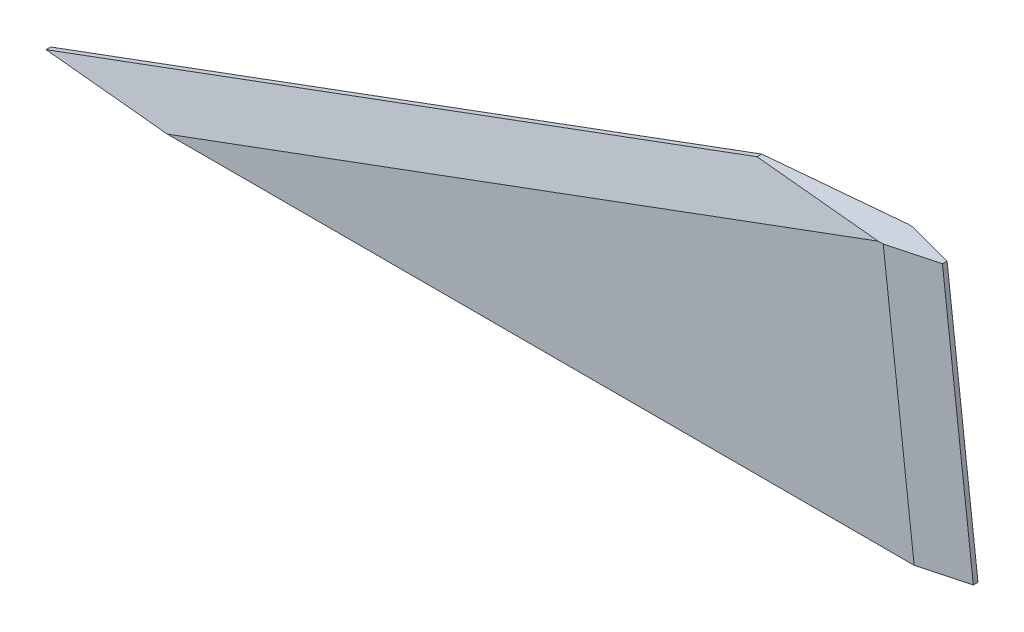
ISO-10303-21;
HEADER;
FILE_DESCRIPTION(('STEP AP214'),'2;1');
FILE_NAME('part.step','',(''),(''),'','','');
FILE_SCHEMA(('AUTOMOTIVE_DESIGN { 1 0 10303 214 1 1 1 1 }'));
ENDSEC;
DATA;
#1=APPLICATION_CONTEXT('core data for automotive mechanical design processes');
#2=APPLICATION_PROTOCOL_DEFINITION('international standard','automotive_design',2000,#1);
#3=PRODUCT_CONTEXT('',#1,'mechanical');
#4=PRODUCT('Part','Part','',(#3));
#5=PRODUCT_RELATED_PRODUCT_CATEGORY('part','',(#4));
#6=PRODUCT_DEFINITION_FORMATION('','',#4);
#7=PRODUCT_DEFINITION_CONTEXT('part definition',#1,'design');
#8=PRODUCT_DEFINITION('design','',#6,#7);
#9=PRODUCT_DEFINITION_SHAPE('','',#8);
#10=(LENGTH_UNIT() NAMED_UNIT(*) SI_UNIT(.MILLI.,.METRE.));
#11=(NAMED_UNIT(*) PLANE_ANGLE_UNIT() SI_UNIT($,.RADIAN.));
#12=(NAMED_UNIT(*) SI_UNIT($,.STERADIAN.) SOLID_ANGLE_UNIT());
#13=UNCERTAINTY_MEASURE_WITH_UNIT(LENGTH_MEASURE(1.E-05),#10,'distance_accuracy_value','');
#14=(GEOMETRIC_REPRESENTATION_CONTEXT(3) GLOBAL_UNCERTAINTY_ASSIGNED_CONTEXT((#13)) GLOBAL_UNIT_ASSIGNED_CONTEXT((#10,
#11,#12)) REPRESENTATION_CONTEXT('',''));
#15=CARTESIAN_POINT('',(0.,0.,0.));
#16=DIRECTION('',(0.,0.,1.));
#17=DIRECTION('',(1.,0.,0.));
#18=AXIS2_PLACEMENT_3D('',#15,#16,#17);
#19=CARTESIAN_POINT('',(76.2,0.,1.2192));
#20=DIRECTION('',(0.,1.,0.));
#21=DIRECTION('',(0.,0.,1.));
#22=AXIS2_PLACEMENT_3D('',#19,#20,#21);
#23=PLANE('',#22);
#24=DIRECTION('',(0.,0.,-1.));
#25=VECTOR('',#24,1.);
#26=CARTESIAN_POINT('',(76.2,0.,1.2192));
#27=LINE('',#26,#25);
#28=CARTESIAN_POINT('',(76.2,0.,0.190499999999973));
#29=VERTEX_POINT('',#28);
#30=CARTESIAN_POINT('',(76.2,0.,-0.190499999999999));
#31=VERTEX_POINT('',#30);
#32=EDGE_CURVE('E136',#29,#31,#27,.T.);
#33=ORIENTED_EDGE('',*,*,#32,.F.);
#34=DIRECTION('',(-0.965877160229926,0.,0.259000601053691));
#35=VECTOR('',#34,1.);
#36=CARTESIAN_POINT('',(71.4420928321807,0.,1.46633596233861));
#37=LINE('',#36,#35);
#38=CARTESIAN_POINT('',(72.3637238265614,0.,1.2192));
#39=VERTEX_POINT('',#38);
#40=EDGE_CURVE('E55',#29,#39,#37,.T.);
#41=ORIENTED_EDGE('',*,*,#40,.T.);
#42=DIRECTION('',(1.,0.,0.));
#43=VECTOR('',#42,1.);
#44=CARTESIAN_POINT('',(76.2,0.,1.2192));
#45=LINE('',#44,#43);
#46=CARTESIAN_POINT('',(10.9909085581792,0.,1.2192));
#47=VERTEX_POINT('',#46);
#48=EDGE_CURVE('E130',#47,#39,#45,.T.);
#49=ORIENTED_EDGE('',*,*,#48,.F.);
#50=DIRECTION('',(-0.995648506569009,0.,-0.0931882576664113));
#51=VECTOR('',#50,1.);
#52=CARTESIAN_POINT('',(1.40471330294,0.,0.321974897374045));
#53=LINE('',#52,#51);
#54=CARTESIAN_POINT('',(0.,0.,0.190499999999974));
#55=VERTEX_POINT('',#54);
#56=EDGE_CURVE('E113',#47,#55,#53,.T.);
#57=ORIENTED_EDGE('',*,*,#56,.T.);
#58=DIRECTION('',(0.,0.,-1.));
#59=VECTOR('',#58,1.);
#60=CARTESIAN_POINT('',(0.,0.,1.2192));
#61=LINE('',#60,#59);
#62=CARTESIAN_POINT('',(0.,0.,-0.190499999999999));
#63=VERTEX_POINT('',#62);
#64=EDGE_CURVE('E144',#55,#63,#61,.T.);
#65=ORIENTED_EDGE('',*,*,#64,.T.);
#66=DIRECTION('',(-0.99564850656901,0.,0.0931882576664078));
#67=VECTOR('',#66,1.);
#68=CARTESIAN_POINT('',(0.,0.,-0.190499999999999));
#69=LINE('',#68,#67);
#70=CARTESIAN_POINT('',(10.9909085581793,0.,-1.2192));
#71=VERTEX_POINT('',#70);
#72=EDGE_CURVE('E124',#63,#71,#69,.F.);
#73=ORIENTED_EDGE('',*,*,#72,.T.);
#74=DIRECTION('',(1.,0.,0.));
#75=VECTOR('',#74,1.);
#76=CARTESIAN_POINT('',(76.2,0.,-1.2192));
#77=LINE('',#76,#75);
#78=CARTESIAN_POINT('',(72.3637238265614,0.,-1.2192));
#79=VERTEX_POINT('',#78);
#80=EDGE_CURVE('E146',#71,#79,#77,.T.);
#81=ORIENTED_EDGE('',*,*,#80,.T.);
#82=DIRECTION('',(-0.965877160229929,0.,-0.259000601053682));
#83=VECTOR('',#82,1.);
#84=CARTESIAN_POINT('',(73.8303865308193,0.,-0.825913423210683));
#85=LINE('',#84,#83);
#86=EDGE_CURVE('E67',#79,#31,#85,.F.);
#87=ORIENTED_EDGE('',*,*,#86,.T.);
#88=EDGE_LOOP('',(#33,#41,#49,#57,#65,#73,#81,#87));
#89=FACE_BOUND('',#88,.T.);
#90=ADVANCED_FACE('F45',(#89),#23,.F.);
#91=CARTESIAN_POINT('',(73.66,21.59,1.2192));
#92=DIRECTION('',(-0.993150604322876,-0.116841247567398,0.));
#93=DIRECTION('',(0.116841247567398,-0.993150604322876,0.));
#94=AXIS2_PLACEMENT_3D('',#91,#92,#93);
#95=PLANE('',#94);
#96=DIRECTION('',(0.,0.,-1.));
#97=VECTOR('',#96,1.);
#98=CARTESIAN_POINT('',(73.66,21.59,1.2192));
#99=LINE('',#98,#97);
#100=CARTESIAN_POINT('',(73.66,21.59,0.190499999999973));
#101=VERTEX_POINT('',#100);
#102=CARTESIAN_POINT('',(73.66,21.59,-0.190499999999999));
#103=VERTEX_POINT('',#102);
#104=EDGE_CURVE('E157',#101,#103,#99,.T.);
#105=ORIENTED_EDGE('',*,*,#104,.F.);
#106=DIRECTION('',(0.116841247567398,-0.993150604322876,0.));
#107=VECTOR('',#106,1.);
#108=CARTESIAN_POINT('',(76.2,0.,0.190499999999973));
#109=LINE('',#108,#107);
#110=EDGE_CURVE('E193',#101,#29,#109,.T.);
#111=ORIENTED_EDGE('',*,*,#110,.T.);
#112=ORIENTED_EDGE('',*,*,#32,.T.);
#113=DIRECTION('',(-0.116841247567398,0.993150604322876,0.));
#114=VECTOR('',#113,1.);
#115=CARTESIAN_POINT('',(73.66,21.59,-0.190499999999999));
#116=LINE('',#115,#114);
#117=EDGE_CURVE('E189',#31,#103,#116,.T.);
#118=ORIENTED_EDGE('',*,*,#117,.T.);
#119=EDGE_LOOP('',(#105,#111,#112,#118));
#120=FACE_BOUND('',#119,.T.);
#121=ADVANCED_FACE('F201',(#120),#95,.F.);
#122=CARTESIAN_POINT('',(58.42,21.59,1.2192));
#123=DIRECTION('',(0.,-1.,0.));
#124=DIRECTION('',(1.,0.,0.));
#125=AXIS2_PLACEMENT_3D('',#122,#123,#124);
#126=PLANE('',#125);
#127=DIRECTION('',(-1.,0.,0.));
#128=VECTOR('',#127,1.);
#129=CARTESIAN_POINT('',(58.42,21.59,1.2192));
#130=LINE('',#129,#128);
#131=CARTESIAN_POINT('',(69.8237238265614,21.59,1.2192));
#132=VERTEX_POINT('',#131);
#133=CARTESIAN_POINT('',(69.4109085581792,21.59,1.2192));
#134=VERTEX_POINT('',#133);
#135=EDGE_CURVE('E133',#132,#134,#130,.T.);
#136=ORIENTED_EDGE('',*,*,#135,.F.);
#137=DIRECTION('',(0.965877160229926,0.,-0.259000601053691));
#138=VECTOR('',#137,1.);
#139=CARTESIAN_POINT('',(71.2717063013614,21.59,0.830922539127903));
#140=LINE('',#139,#138);
#141=EDGE_CURVE('E186',#132,#101,#140,.T.);
#142=ORIENTED_EDGE('',*,*,#141,.T.);
#143=ORIENTED_EDGE('',*,*,#104,.T.);
#144=DIRECTION('',(0.965877160229929,0.,0.259000601053682));
#145=VECTOR('',#144,1.);
#146=CARTESIAN_POINT('',(73.66,21.59,-0.190499999999999));
#147=LINE('',#146,#145);
#148=CARTESIAN_POINT('',(69.8237238265613,21.59,-1.2192));
#149=VERTEX_POINT('',#148);
#150=EDGE_CURVE('E183',#103,#149,#147,.F.);
#151=ORIENTED_EDGE('',*,*,#150,.T.);
#152=DIRECTION('',(-1.,0.,0.));
#153=VECTOR('',#152,1.);
#154=CARTESIAN_POINT('',(58.42,21.59,-1.2192));
#155=LINE('',#154,#153);
#156=CARTESIAN_POINT('',(69.4109085581793,21.59,-1.2192));
#157=VERTEX_POINT('',#156);
#158=EDGE_CURVE('E140',#149,#157,#155,.T.);
#159=ORIENTED_EDGE('',*,*,#158,.T.);
#160=DIRECTION('',(0.99564850656901,0.,-0.0931882576664077));
#161=VECTOR('',#160,1.);
#162=CARTESIAN_POINT('',(0.50732228085434,21.59,5.2298682301906));
#163=LINE('',#162,#161);
#164=CARTESIAN_POINT('',(58.42,21.59,-0.190499999999999));
#165=VERTEX_POINT('',#164);
#166=EDGE_CURVE('E170',#157,#165,#163,.F.);
#167=ORIENTED_EDGE('',*,*,#166,.T.);
#168=DIRECTION('',(0.,0.,-1.));
#169=VECTOR('',#168,1.);
#170=CARTESIAN_POINT('',(58.42,21.59,1.2192));
#171=LINE('',#170,#169);
#172=CARTESIAN_POINT('',(58.42,21.59,0.190499999999974));
#173=VERTEX_POINT('',#172);
#174=EDGE_CURVE('E153',#173,#165,#171,.T.);
#175=ORIENTED_EDGE('',*,*,#174,.F.);
#176=DIRECTION('',(0.995648506569009,0.,0.0931882576664112));
#177=VECTOR('',#176,1.);
#178=CARTESIAN_POINT('',(1.91203558379438,21.59,-5.09839333281675));
#179=LINE('',#178,#177);
#180=EDGE_CURVE('E173',#173,#134,#179,.T.);
#181=ORIENTED_EDGE('',*,*,#180,.T.);
#182=EDGE_LOOP('',(#136,#142,#143,#151,#159,#167,#175,#181));
#183=FACE_BOUND('',#182,.T.);
#184=ADVANCED_FACE('F206',(#183),#126,.F.);
#185=CARTESIAN_POINT('',(0.,0.,1.2192));
#186=DIRECTION('',(0.346650140871629,-0.937994498829114,0.));
#187=DIRECTION('',(0.937994498829114,0.346650140871629,0.));
#188=AXIS2_PLACEMENT_3D('',#185,#186,#187);
#189=PLANE('',#188);
#190=ORIENTED_EDGE('',*,*,#64,.F.);
#191=DIRECTION('',(0.937994498829114,0.346650140871629,0.));
#192=VECTOR('',#191,1.);
#193=CARTESIAN_POINT('',(58.42,21.59,0.190499999999974));
#194=LINE('',#193,#192);
#195=EDGE_CURVE('E118',#55,#173,#194,.T.);
#196=ORIENTED_EDGE('',*,*,#195,.T.);
#197=ORIENTED_EDGE('',*,*,#174,.T.);
#198=DIRECTION('',(-0.937994498829114,-0.346650140871629,0.));
#199=VECTOR('',#198,1.);
#200=CARTESIAN_POINT('',(0.,0.,-0.190499999999999));
#201=LINE('',#200,#199);
#202=EDGE_CURVE('E123',#165,#63,#201,.T.);
#203=ORIENTED_EDGE('',*,*,#202,.T.);
#204=EDGE_LOOP('',(#190,#196,#197,#203));
#205=FACE_BOUND('',#204,.T.);
#206=ADVANCED_FACE('F211',(#205),#189,.F.);
#207=CARTESIAN_POINT('',(0.,0.,1.2192));
#208=DIRECTION('',(0.,0.,1.));
#209=DIRECTION('',(1.,0.,0.));
#210=AXIS2_PLACEMENT_3D('',#207,#208,#209);
#211=PLANE('',#210);
#212=ORIENTED_EDGE('',*,*,#48,.T.);
#213=DIRECTION('',(-0.116841247567398,0.993150604322876,0.));
#214=VECTOR('',#213,1.);
#215=CARTESIAN_POINT('',(69.8760961975298,21.1448348467682,1.2192));
#216=LINE('',#215,#214);
#217=EDGE_CURVE('E180',#39,#132,#216,.T.);
#218=ORIENTED_EDGE('',*,*,#217,.T.);
#219=ORIENTED_EDGE('',*,*,#135,.T.);
#220=DIRECTION('',(-0.937994498829114,-0.346650140871629,0.));
#221=VECTOR('',#220,1.);
#222=CARTESIAN_POINT('',(1.32073703672091,-3.57375904053893,1.2192));
#223=LINE('',#222,#221);
#224=EDGE_CURVE('E117',#134,#47,#223,.T.);
#225=ORIENTED_EDGE('',*,*,#224,.T.);
#226=EDGE_LOOP('',(#212,#218,#219,#225));
#227=FACE_BOUND('',#226,.T.);
#228=ADVANCED_FACE('F128',(#227),#211,.T.);
#229=CARTESIAN_POINT('',(0.,0.,-1.2192));
#230=DIRECTION('',(0.,0.,1.));
#231=DIRECTION('',(1.,0.,0.));
#232=AXIS2_PLACEMENT_3D('',#229,#230,#231);
#233=PLANE('',#232);
#234=ORIENTED_EDGE('',*,*,#158,.F.);
#235=DIRECTION('',(0.116841247567398,-0.993150604322876,0.));
#236=VECTOR('',#235,1.);
#237=CARTESIAN_POINT('',(71.3758231599871,8.39715566588089,-1.2192));
#238=LINE('',#237,#236);
#239=EDGE_CURVE('E11',#149,#79,#238,.T.);
#240=ORIENTED_EDGE('',*,*,#239,.T.);
#241=ORIENTED_EDGE('',*,*,#80,.F.);
#242=DIRECTION('',(0.937994498829114,0.346650140871629,0.));
#243=VECTOR('',#242,1.);
#244=CARTESIAN_POINT('',(1.32073703672092,-3.57375904053897,-1.2192));
#245=LINE('',#244,#243);
#246=EDGE_CURVE('E176',#71,#157,#245,.T.);
#247=ORIENTED_EDGE('',*,*,#246,.T.);
#248=EDGE_LOOP('',(#234,#240,#241,#247));
#249=FACE_BOUND('',#248,.T.);
#250=ADVANCED_FACE('F215',(#249),#233,.F.);
#251=CARTESIAN_POINT('',(1.32073703672091,-3.57375904053893,1.2192));
#252=DIRECTION('',(-0.0903598544170188,0.244503135481345,0.965429082558386));
#253=DIRECTION('',(0.937994498829114,0.346650140871629,0.));
#254=AXIS2_PLACEMENT_3D('',#251,#252,#253);
#255=PLANE('',#254);
#256=ORIENTED_EDGE('',*,*,#180,.F.);
#257=ORIENTED_EDGE('',*,*,#195,.F.);
#258=ORIENTED_EDGE('',*,*,#56,.F.);
#259=ORIENTED_EDGE('',*,*,#224,.F.);
#260=EDGE_LOOP('',(#256,#257,#258,#259));
#261=FACE_BOUND('',#260,.T.);
#262=ADVANCED_FACE('F116',(#261),#255,.T.);
#263=CARTESIAN_POINT('',(0.,0.,-0.190499999999999));
#264=DIRECTION('',(0.0903598544170156,-0.244503135481336,0.965429082558388));
#265=DIRECTION('',(-0.937994498829114,-0.346650140871629,0.));
#266=AXIS2_PLACEMENT_3D('',#263,#264,#265);
#267=PLANE('',#266);
#268=ORIENTED_EDGE('',*,*,#166,.F.);
#269=ORIENTED_EDGE('',*,*,#246,.F.);
#270=ORIENTED_EDGE('',*,*,#72,.F.);
#271=ORIENTED_EDGE('',*,*,#202,.F.);
#272=EDGE_LOOP('',(#268,#269,#270,#271));
#273=FACE_BOUND('',#272,.T.);
#274=ADVANCED_FACE('F213',(#273),#267,.F.);
#275=CARTESIAN_POINT('',(71.3758231599872,8.39715566588089,1.2192));
#276=DIRECTION('',(0.258880448728917,0.0304565233798728,0.965429082558386));
#277=DIRECTION('',(0.116841247567398,-0.993150604322876,0.));
#278=AXIS2_PLACEMENT_3D('',#275,#276,#277);
#279=PLANE('',#278);
#280=ORIENTED_EDGE('',*,*,#40,.F.);
#281=ORIENTED_EDGE('',*,*,#110,.F.);
#282=ORIENTED_EDGE('',*,*,#141,.F.);
#283=ORIENTED_EDGE('',*,*,#217,.F.);
#284=EDGE_LOOP('',(#280,#281,#282,#283));
#285=FACE_BOUND('',#284,.T.);
#286=ADVANCED_FACE('F204',(#285),#279,.T.);
#287=CARTESIAN_POINT('',(73.66,21.59,-0.190499999999999));
#288=DIRECTION('',(-0.258880448728908,-0.0304565233798717,0.965429082558388));
#289=DIRECTION('',(-0.116841247567398,0.993150604322876,0.));
#290=AXIS2_PLACEMENT_3D('',#287,#288,#289);
#291=PLANE('',#290);
#292=ORIENTED_EDGE('',*,*,#86,.F.);
#293=ORIENTED_EDGE('',*,*,#239,.F.);
#294=ORIENTED_EDGE('',*,*,#150,.F.);
#295=ORIENTED_EDGE('',*,*,#117,.F.);
#296=EDGE_LOOP('',(#292,#293,#294,#295));
#297=FACE_BOUND('',#296,.T.);
#298=ADVANCED_FACE('F48',(#297),#291,.F.);
#299=CLOSED_SHELL('',(#90,#121,#184,#206,#228,#250,#262,#274,#286,#298));
#300=MANIFOLD_SOLID_BREP('B2',#299);
#301=ADVANCED_BREP_SHAPE_REPRESENTATION('',(#18,#300),#14);
#302=SHAPE_DEFINITION_REPRESENTATION(#9,#301);
ENDSEC;
END-ISO-10303-21;
